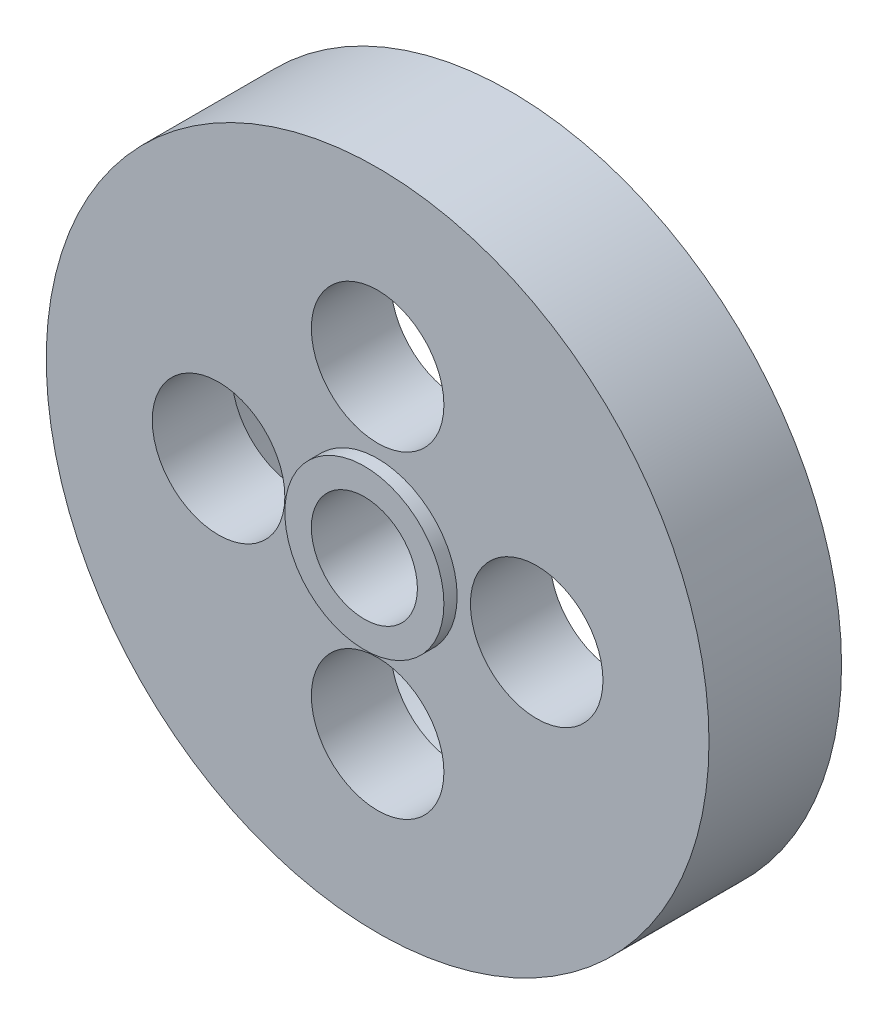
ISO-10303-21;
HEADER;
FILE_DESCRIPTION(('STEP AP214'),'2;1');
FILE_NAME('part.step','',(''),(''),'','','');
FILE_SCHEMA(('AUTOMOTIVE_DESIGN { 1 0 10303 214 1 1 1 1 }'));
ENDSEC;
DATA;
#1=APPLICATION_CONTEXT('core data for automotive mechanical design processes');
#2=APPLICATION_PROTOCOL_DEFINITION('international standard','automotive_design',2000,#1);
#3=PRODUCT_CONTEXT('',#1,'mechanical');
#4=PRODUCT('Part','Part','',(#3));
#5=PRODUCT_RELATED_PRODUCT_CATEGORY('part','',(#4));
#6=PRODUCT_DEFINITION_FORMATION('','',#4);
#7=PRODUCT_DEFINITION_CONTEXT('part definition',#1,'design');
#8=PRODUCT_DEFINITION('design','',#6,#7);
#9=PRODUCT_DEFINITION_SHAPE('','',#8);
#10=(LENGTH_UNIT() NAMED_UNIT(*) SI_UNIT(.MILLI.,.METRE.));
#11=(NAMED_UNIT(*) PLANE_ANGLE_UNIT() SI_UNIT($,.RADIAN.));
#12=(NAMED_UNIT(*) SI_UNIT($,.STERADIAN.) SOLID_ANGLE_UNIT());
#13=UNCERTAINTY_MEASURE_WITH_UNIT(LENGTH_MEASURE(1.E-05),#10,'distance_accuracy_value','');
#14=(GEOMETRIC_REPRESENTATION_CONTEXT(3) GLOBAL_UNCERTAINTY_ASSIGNED_CONTEXT((#13)) GLOBAL_UNIT_ASSIGNED_CONTEXT((#10,
#11,#12)) REPRESENTATION_CONTEXT('',''));
#15=CARTESIAN_POINT('',(0.,0.,0.));
#16=DIRECTION('',(0.,0.,1.));
#17=DIRECTION('',(1.,0.,0.));
#18=AXIS2_PLACEMENT_3D('',#15,#16,#17);
#19=CARTESIAN_POINT('',(0.,0.,5.));
#20=DIRECTION('',(0.,0.,1.));
#21=DIRECTION('',(1.,0.,0.));
#22=AXIS2_PLACEMENT_3D('',#19,#20,#21);
#23=PLANE('',#22);
#24=CARTESIAN_POINT('',(-11.9999999999997,-3.4032572508536E-13,5.));
#25=DIRECTION('',(0.,0.,1.));
#26=DIRECTION('',(1.,0.,0.));
#27=AXIS2_PLACEMENT_3D('',#24,#25,#26);
#28=CIRCLE('',#27,5.00000000000055);
#29=CARTESIAN_POINT('',(-6.99999999999912,-3.4032572508536E-13,5.));
#30=VERTEX_POINT('',#29);
#31=EDGE_CURVE('E65',#30,#30,#28,.T.);
#32=ORIENTED_EDGE('',*,*,#31,.F.);
#33=EDGE_LOOP('',(#32));
#34=FACE_BOUND('',#33,.T.);
#35=CARTESIAN_POINT('',(12.,0.,5.));
#36=DIRECTION('',(0.,0.,1.));
#37=DIRECTION('',(1.,0.,0.));
#38=AXIS2_PLACEMENT_3D('',#35,#36,#37);
#39=CIRCLE('',#38,5.);
#40=CARTESIAN_POINT('',(17.,0.,5.));
#41=VERTEX_POINT('',#40);
#42=EDGE_CURVE('E57',#41,#41,#39,.T.);
#43=ORIENTED_EDGE('',*,*,#42,.F.);
#44=EDGE_LOOP('',(#43));
#45=FACE_BOUND('',#44,.T.);
#46=CARTESIAN_POINT('',(0.,12.,5.));
#47=DIRECTION('',(0.,0.,1.));
#48=DIRECTION('',(1.,0.,0.));
#49=AXIS2_PLACEMENT_3D('',#46,#47,#48);
#50=CIRCLE('',#49,5.);
#51=CARTESIAN_POINT('',(5.,12.,5.));
#52=VERTEX_POINT('',#51);
#53=EDGE_CURVE('E52',#52,#52,#50,.T.);
#54=ORIENTED_EDGE('',*,*,#53,.F.);
#55=EDGE_LOOP('',(#54));
#56=FACE_BOUND('',#55,.T.);
#57=CARTESIAN_POINT('',(0.,0.,5.));
#58=DIRECTION('',(0.,0.,1.));
#59=DIRECTION('',(1.,0.,0.));
#60=AXIS2_PLACEMENT_3D('',#57,#58,#59);
#61=CIRCLE('',#60,25.);
#62=CARTESIAN_POINT('',(25.,0.,5.));
#63=VERTEX_POINT('',#62);
#64=EDGE_CURVE('E10',#63,#63,#61,.T.);
#65=ORIENTED_EDGE('',*,*,#64,.T.);
#66=EDGE_LOOP('',(#65));
#67=FACE_BOUND('',#66,.T.);
#68=CARTESIAN_POINT('',(6.77712297852766E-13,-12.,5.));
#69=DIRECTION('',(0.,0.,1.));
#70=DIRECTION('',(1.,0.,0.));
#71=AXIS2_PLACEMENT_3D('',#68,#69,#70);
#72=CIRCLE('',#71,5.00000000000073);
#73=CARTESIAN_POINT('',(5.00000000000141,-12.,5.));
#74=VERTEX_POINT('',#73);
#75=EDGE_CURVE('E61',#74,#74,#72,.T.);
#76=ORIENTED_EDGE('',*,*,#75,.F.);
#77=EDGE_LOOP('',(#76));
#78=FACE_BOUND('',#77,.T.);
#79=CARTESIAN_POINT('',(0.,0.,5.));
#80=DIRECTION('',(0.,0.,1.));
#81=DIRECTION('',(1.,0.,0.));
#82=AXIS2_PLACEMENT_3D('',#79,#80,#81);
#83=CIRCLE('',#82,6.);
#84=CARTESIAN_POINT('',(6.,0.,5.));
#85=VERTEX_POINT('',#84);
#86=EDGE_CURVE('E94',#85,#85,#83,.T.);
#87=ORIENTED_EDGE('',*,*,#86,.F.);
#88=EDGE_LOOP('',(#87));
#89=FACE_BOUND('',#88,.T.);
#90=ADVANCED_FACE('F37',(#34,#45,#56,#67,#78,#89),#23,.T.);
#91=CARTESIAN_POINT('',(0.,12.,5.));
#92=DIRECTION('',(0.,0.,-1.));
#93=DIRECTION('',(-1.,0.,0.));
#94=AXIS2_PLACEMENT_3D('',#91,#92,#93);
#95=CYLINDRICAL_SURFACE('',#94,5.);
#96=ORIENTED_EDGE('',*,*,#53,.T.);
#97=EDGE_LOOP('',(#96));
#98=FACE_BOUND('',#97,.T.);
#99=CARTESIAN_POINT('',(0.,12.,-1.));
#100=DIRECTION('',(0.,0.,-1.));
#101=DIRECTION('',(-1.,0.,0.));
#102=AXIS2_PLACEMENT_3D('',#99,#100,#101);
#103=CIRCLE('',#102,5.);
#104=CARTESIAN_POINT('',(-5.,12.,-1.));
#105=VERTEX_POINT('',#104);
#106=EDGE_CURVE('E69',#105,#105,#103,.T.);
#107=ORIENTED_EDGE('',*,*,#106,.T.);
#108=EDGE_LOOP('',(#107));
#109=FACE_BOUND('',#108,.T.);
#110=ADVANCED_FACE('F124',(#98,#109),#95,.F.);
#111=CARTESIAN_POINT('',(0.,0.,5.));
#112=DIRECTION('',(0.,0.,-1.));
#113=DIRECTION('',(-1.,0.,0.));
#114=AXIS2_PLACEMENT_3D('',#111,#112,#113);
#115=CYLINDRICAL_SURFACE('',#114,4.);
#116=CARTESIAN_POINT('',(0.,0.,-1.));
#117=DIRECTION('',(0.,0.,-1.));
#118=DIRECTION('',(-1.,0.,0.));
#119=AXIS2_PLACEMENT_3D('',#116,#117,#118);
#120=CIRCLE('',#119,4.);
#121=CARTESIAN_POINT('',(-4.,0.,-1.));
#122=VERTEX_POINT('',#121);
#123=EDGE_CURVE('E73',#122,#122,#120,.T.);
#124=ORIENTED_EDGE('',*,*,#123,.T.);
#125=EDGE_LOOP('',(#124));
#126=FACE_BOUND('',#125,.T.);
#127=CARTESIAN_POINT('',(0.,0.,6.));
#128=DIRECTION('',(0.,0.,1.));
#129=DIRECTION('',(1.,0.,0.));
#130=AXIS2_PLACEMENT_3D('',#127,#128,#129);
#131=CIRCLE('',#130,4.);
#132=CARTESIAN_POINT('',(4.,0.,6.));
#133=VERTEX_POINT('',#132);
#134=EDGE_CURVE('E98',#133,#133,#131,.T.);
#135=ORIENTED_EDGE('',*,*,#134,.T.);
#136=EDGE_LOOP('',(#135));
#137=FACE_BOUND('',#136,.T.);
#138=ADVANCED_FACE('F106',(#126,#137),#115,.F.);
#139=CARTESIAN_POINT('',(12.,0.,5.));
#140=DIRECTION('',(0.,0.,-1.));
#141=DIRECTION('',(-1.,0.,0.));
#142=AXIS2_PLACEMENT_3D('',#139,#140,#141);
#143=CYLINDRICAL_SURFACE('',#142,5.);
#144=ORIENTED_EDGE('',*,*,#42,.T.);
#145=EDGE_LOOP('',(#144));
#146=FACE_BOUND('',#145,.T.);
#147=CARTESIAN_POINT('',(12.,0.,-1.));
#148=DIRECTION('',(0.,0.,-1.));
#149=DIRECTION('',(-1.,0.,0.));
#150=AXIS2_PLACEMENT_3D('',#147,#148,#149);
#151=CIRCLE('',#150,5.);
#152=CARTESIAN_POINT('',(7.,0.,-1.));
#153=VERTEX_POINT('',#152);
#154=EDGE_CURVE('E77',#153,#153,#151,.T.);
#155=ORIENTED_EDGE('',*,*,#154,.T.);
#156=EDGE_LOOP('',(#155));
#157=FACE_BOUND('',#156,.T.);
#158=ADVANCED_FACE('F161',(#146,#157),#143,.F.);
#159=CARTESIAN_POINT('',(6.77712297852766E-13,-12.,5.));
#160=DIRECTION('',(0.,0.,-1.));
#161=DIRECTION('',(-1.,0.,0.));
#162=AXIS2_PLACEMENT_3D('',#159,#160,#161);
#163=CYLINDRICAL_SURFACE('',#162,5.00000000000073);
#164=ORIENTED_EDGE('',*,*,#75,.T.);
#165=EDGE_LOOP('',(#164));
#166=FACE_BOUND('',#165,.T.);
#167=CARTESIAN_POINT('',(6.77712297852766E-13,-12.,-1.));
#168=DIRECTION('',(0.,0.,-1.));
#169=DIRECTION('',(-1.,0.,0.));
#170=AXIS2_PLACEMENT_3D('',#167,#168,#169);
#171=CIRCLE('',#170,5.00000000000073);
#172=CARTESIAN_POINT('',(-5.00000000000005,-12.,-1.));
#173=VERTEX_POINT('',#172);
#174=EDGE_CURVE('E81',#173,#173,#171,.T.);
#175=ORIENTED_EDGE('',*,*,#174,.T.);
#176=EDGE_LOOP('',(#175));
#177=FACE_BOUND('',#176,.T.);
#178=ADVANCED_FACE('F144',(#166,#177),#163,.F.);
#179=CARTESIAN_POINT('',(-11.9999999999997,-3.4032572508536E-13,5.));
#180=DIRECTION('',(0.,0.,-1.));
#181=DIRECTION('',(-1.,0.,0.));
#182=AXIS2_PLACEMENT_3D('',#179,#180,#181);
#183=CYLINDRICAL_SURFACE('',#182,5.00000000000055);
#184=ORIENTED_EDGE('',*,*,#31,.T.);
#185=EDGE_LOOP('',(#184));
#186=FACE_BOUND('',#185,.T.);
#187=CARTESIAN_POINT('',(-11.9999999999997,-3.4032572508536E-13,-1.));
#188=DIRECTION('',(0.,0.,-1.));
#189=DIRECTION('',(-1.,0.,0.));
#190=AXIS2_PLACEMENT_3D('',#187,#188,#189);
#191=CIRCLE('',#190,5.00000000000055);
#192=CARTESIAN_POINT('',(-17.0000000000002,-3.4032572508536E-13,-1.));
#193=VERTEX_POINT('',#192);
#194=EDGE_CURVE('E41',#193,#193,#191,.T.);
#195=ORIENTED_EDGE('',*,*,#194,.T.);
#196=EDGE_LOOP('',(#195));
#197=FACE_BOUND('',#196,.T.);
#198=ADVANCED_FACE('F137',(#186,#197),#183,.F.);
#199=CARTESIAN_POINT('',(0.,0.,-5.));
#200=DIRECTION('',(0.,0.,1.));
#201=DIRECTION('',(1.,0.,0.));
#202=AXIS2_PLACEMENT_3D('',#199,#200,#201);
#203=PLANE('',#202);
#204=CARTESIAN_POINT('',(0.,0.,-5.));
#205=DIRECTION('',(0.,0.,-1.));
#206=DIRECTION('',(-1.,0.,0.));
#207=AXIS2_PLACEMENT_3D('',#204,#205,#206);
#208=CIRCLE('',#207,18.);
#209=CARTESIAN_POINT('',(-18.,0.,-5.));
#210=VERTEX_POINT('',#209);
#211=EDGE_CURVE('E85',#210,#210,#208,.T.);
#212=ORIENTED_EDGE('',*,*,#211,.F.);
#213=EDGE_LOOP('',(#212));
#214=FACE_BOUND('',#213,.T.);
#215=CARTESIAN_POINT('',(0.,0.,-5.));
#216=DIRECTION('',(0.,0.,1.));
#217=DIRECTION('',(1.,0.,0.));
#218=AXIS2_PLACEMENT_3D('',#215,#216,#217);
#219=CIRCLE('',#218,25.);
#220=CARTESIAN_POINT('',(25.,0.,-5.));
#221=VERTEX_POINT('',#220);
#222=EDGE_CURVE('E46',#221,#221,#219,.T.);
#223=ORIENTED_EDGE('',*,*,#222,.F.);
#224=EDGE_LOOP('',(#223));
#225=FACE_BOUND('',#224,.T.);
#226=ADVANCED_FACE('F135',(#214,#225),#203,.F.);
#227=CARTESIAN_POINT('',(0.,0.,5.));
#228=DIRECTION('',(0.,0.,-1.));
#229=DIRECTION('',(-1.,0.,0.));
#230=AXIS2_PLACEMENT_3D('',#227,#228,#229);
#231=CYLINDRICAL_SURFACE('',#230,25.);
#232=ORIENTED_EDGE('',*,*,#64,.F.);
#233=EDGE_LOOP('',(#232));
#234=FACE_BOUND('',#233,.T.);
#235=ORIENTED_EDGE('',*,*,#222,.T.);
#236=EDGE_LOOP('',(#235));
#237=FACE_BOUND('',#236,.T.);
#238=ADVANCED_FACE('F39',(#234,#237),#231,.T.);
#239=CARTESIAN_POINT('',(0.,0.,-1.));
#240=DIRECTION('',(0.,0.,-1.));
#241=DIRECTION('',(-1.,0.,0.));
#242=AXIS2_PLACEMENT_3D('',#239,#240,#241);
#243=CYLINDRICAL_SURFACE('',#242,18.);
#244=CARTESIAN_POINT('',(0.,0.,-1.));
#245=DIRECTION('',(0.,0.,-1.));
#246=DIRECTION('',(-1.,0.,0.));
#247=AXIS2_PLACEMENT_3D('',#244,#245,#246);
#248=CIRCLE('',#247,18.);
#249=CARTESIAN_POINT('',(-18.,0.,-1.));
#250=VERTEX_POINT('',#249);
#251=EDGE_CURVE('E89',#250,#250,#248,.T.);
#252=ORIENTED_EDGE('',*,*,#251,.F.);
#253=EDGE_LOOP('',(#252));
#254=FACE_BOUND('',#253,.T.);
#255=ORIENTED_EDGE('',*,*,#211,.T.);
#256=EDGE_LOOP('',(#255));
#257=FACE_BOUND('',#256,.T.);
#258=ADVANCED_FACE('F120',(#254,#257),#243,.F.);
#259=CARTESIAN_POINT('',(0.,0.,-1.));
#260=DIRECTION('',(0.,0.,-1.));
#261=DIRECTION('',(-1.,0.,0.));
#262=AXIS2_PLACEMENT_3D('',#259,#260,#261);
#263=PLANE('',#262);
#264=ORIENTED_EDGE('',*,*,#106,.F.);
#265=EDGE_LOOP('',(#264));
#266=FACE_BOUND('',#265,.T.);
#267=ORIENTED_EDGE('',*,*,#123,.F.);
#268=EDGE_LOOP('',(#267));
#269=FACE_BOUND('',#268,.T.);
#270=ORIENTED_EDGE('',*,*,#154,.F.);
#271=EDGE_LOOP('',(#270));
#272=FACE_BOUND('',#271,.T.);
#273=ORIENTED_EDGE('',*,*,#174,.F.);
#274=EDGE_LOOP('',(#273));
#275=FACE_BOUND('',#274,.T.);
#276=ORIENTED_EDGE('',*,*,#194,.F.);
#277=EDGE_LOOP('',(#276));
#278=FACE_BOUND('',#277,.T.);
#279=ORIENTED_EDGE('',*,*,#251,.T.);
#280=EDGE_LOOP('',(#279));
#281=FACE_BOUND('',#280,.T.);
#282=ADVANCED_FACE('F111',(#266,#269,#272,#275,#278,#281),#263,.T.);
#283=CARTESIAN_POINT('',(0.,0.,6.));
#284=DIRECTION('',(0.,0.,1.));
#285=DIRECTION('',(1.,0.,0.));
#286=AXIS2_PLACEMENT_3D('',#283,#284,#285);
#287=PLANE('',#286);
#288=CARTESIAN_POINT('',(0.,0.,6.));
#289=DIRECTION('',(0.,0.,1.));
#290=DIRECTION('',(1.,0.,0.));
#291=AXIS2_PLACEMENT_3D('',#288,#289,#290);
#292=CIRCLE('',#291,6.);
#293=CARTESIAN_POINT('',(6.,0.,6.));
#294=VERTEX_POINT('',#293);
#295=EDGE_CURVE('E90',#294,#294,#292,.T.);
#296=ORIENTED_EDGE('',*,*,#295,.T.);
#297=EDGE_LOOP('',(#296));
#298=FACE_BOUND('',#297,.T.);
#299=ORIENTED_EDGE('',*,*,#134,.F.);
#300=EDGE_LOOP('',(#299));
#301=FACE_BOUND('',#300,.T.);
#302=ADVANCED_FACE('F108',(#298,#301),#287,.T.);
#303=CARTESIAN_POINT('',(0.,0.,6.));
#304=DIRECTION('',(0.,0.,-1.));
#305=DIRECTION('',(-1.,0.,0.));
#306=AXIS2_PLACEMENT_3D('',#303,#304,#305);
#307=CYLINDRICAL_SURFACE('',#306,6.);
#308=ORIENTED_EDGE('',*,*,#295,.F.);
#309=EDGE_LOOP('',(#308));
#310=FACE_BOUND('',#309,.T.);
#311=ORIENTED_EDGE('',*,*,#86,.T.);
#312=EDGE_LOOP('',(#311));
#313=FACE_BOUND('',#312,.T.);
#314=ADVANCED_FACE('F110',(#310,#313),#307,.T.);
#315=CLOSED_SHELL('',(#90,#110,#138,#158,#178,#198,#226,#238,#258,#282,#302,#314));
#316=MANIFOLD_SOLID_BREP('B2',#315);
#317=ADVANCED_BREP_SHAPE_REPRESENTATION('',(#18,#316),#14);
#318=SHAPE_DEFINITION_REPRESENTATION(#9,#317);
ENDSEC;
END-ISO-10303-21;
